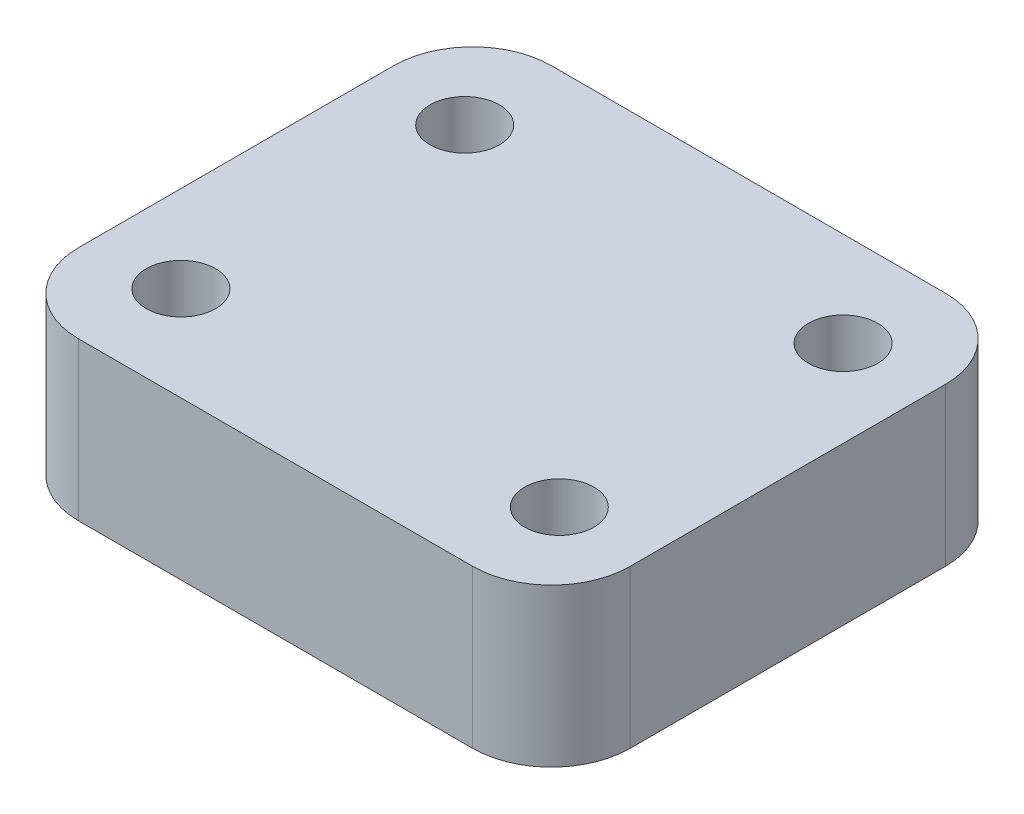
ISO-10303-21;
HEADER;
FILE_DESCRIPTION(('STEP AP214'),'2;1');
FILE_NAME('part.step','',(''),(''),'','','');
FILE_SCHEMA(('AUTOMOTIVE_DESIGN { 1 0 10303 214 1 1 1 1 }'));
ENDSEC;
DATA;
#1=APPLICATION_CONTEXT('core data for automotive mechanical design processes');
#2=APPLICATION_PROTOCOL_DEFINITION('international standard','automotive_design',2000,#1);
#3=PRODUCT_CONTEXT('',#1,'mechanical');
#4=PRODUCT('Part','Part','',(#3));
#5=PRODUCT_RELATED_PRODUCT_CATEGORY('part','',(#4));
#6=PRODUCT_DEFINITION_FORMATION('','',#4);
#7=PRODUCT_DEFINITION_CONTEXT('part definition',#1,'design');
#8=PRODUCT_DEFINITION('design','',#6,#7);
#9=PRODUCT_DEFINITION_SHAPE('','',#8);
#10=(LENGTH_UNIT() NAMED_UNIT(*) SI_UNIT(.MILLI.,.METRE.));
#11=(NAMED_UNIT(*) PLANE_ANGLE_UNIT() SI_UNIT($,.RADIAN.));
#12=(NAMED_UNIT(*) SI_UNIT($,.STERADIAN.) SOLID_ANGLE_UNIT());
#13=UNCERTAINTY_MEASURE_WITH_UNIT(LENGTH_MEASURE(1.E-05),#10,'distance_accuracy_value','');
#14=(GEOMETRIC_REPRESENTATION_CONTEXT(3) GLOBAL_UNCERTAINTY_ASSIGNED_CONTEXT((#13)) GLOBAL_UNIT_ASSIGNED_CONTEXT((#10,
#11,#12)) REPRESENTATION_CONTEXT('',''));
#15=CARTESIAN_POINT('',(0.,0.,0.));
#16=DIRECTION('',(0.,0.,1.));
#17=DIRECTION('',(1.,0.,0.));
#18=AXIS2_PLACEMENT_3D('',#15,#16,#17);
#19=CARTESIAN_POINT('',(17.5,10.,-15.));
#20=DIRECTION('',(-1.,0.,0.));
#21=DIRECTION('',(0.,0.,1.));
#22=AXIS2_PLACEMENT_3D('',#19,#20,#21);
#23=PLANE('',#22);
#24=DIRECTION('',(0.,0.,-1.));
#25=VECTOR('',#24,1.);
#26=CARTESIAN_POINT('',(17.5,0.,-15.));
#27=LINE('',#26,#25);
#28=CARTESIAN_POINT('',(17.5,0.,10.));
#29=VERTEX_POINT('',#28);
#30=CARTESIAN_POINT('',(17.5,0.,-10.));
#31=VERTEX_POINT('',#30);
#32=EDGE_CURVE('E140',#29,#31,#27,.T.);
#33=ORIENTED_EDGE('',*,*,#32,.T.);
#34=DIRECTION('',(0.,-1.,0.));
#35=VECTOR('',#34,1.);
#36=CARTESIAN_POINT('',(17.5,10.,-10.));
#37=LINE('',#36,#35);
#38=CARTESIAN_POINT('',(17.5,10.,-10.));
#39=VERTEX_POINT('',#38);
#40=EDGE_CURVE('E174',#31,#39,#37,.F.);
#41=ORIENTED_EDGE('',*,*,#40,.T.);
#42=DIRECTION('',(0.,0.,-1.));
#43=VECTOR('',#42,1.);
#44=CARTESIAN_POINT('',(17.5,10.,-15.));
#45=LINE('',#44,#43);
#46=CARTESIAN_POINT('',(17.5,10.,10.));
#47=VERTEX_POINT('',#46);
#48=EDGE_CURVE('E138',#47,#39,#45,.T.);
#49=ORIENTED_EDGE('',*,*,#48,.F.);
#50=DIRECTION('',(0.,-1.,0.));
#51=VECTOR('',#50,1.);
#52=CARTESIAN_POINT('',(17.5,10.,10.));
#53=LINE('',#52,#51);
#54=EDGE_CURVE('E170',#47,#29,#53,.T.);
#55=ORIENTED_EDGE('',*,*,#54,.T.);
#56=EDGE_LOOP('',(#33,#41,#49,#55));
#57=FACE_BOUND('',#56,.T.);
#58=ADVANCED_FACE('F39',(#57),#23,.F.);
#59=CARTESIAN_POINT('',(-17.5,10.,-15.));
#60=DIRECTION('',(0.,0.,1.));
#61=DIRECTION('',(1.,0.,0.));
#62=AXIS2_PLACEMENT_3D('',#59,#60,#61);
#63=PLANE('',#62);
#64=DIRECTION('',(-1.,0.,0.));
#65=VECTOR('',#64,1.);
#66=CARTESIAN_POINT('',(-17.5,0.,-15.));
#67=LINE('',#66,#65);
#68=CARTESIAN_POINT('',(12.5,0.,-15.));
#69=VERTEX_POINT('',#68);
#70=CARTESIAN_POINT('',(-12.5,0.,-15.));
#71=VERTEX_POINT('',#70);
#72=EDGE_CURVE('E134',#69,#71,#67,.T.);
#73=ORIENTED_EDGE('',*,*,#72,.T.);
#74=DIRECTION('',(0.,-1.,0.));
#75=VECTOR('',#74,1.);
#76=CARTESIAN_POINT('',(-12.5,10.,-15.));
#77=LINE('',#76,#75);
#78=CARTESIAN_POINT('',(-12.5,10.,-15.));
#79=VERTEX_POINT('',#78);
#80=EDGE_CURVE('E110',#71,#79,#77,.F.);
#81=ORIENTED_EDGE('',*,*,#80,.T.);
#82=DIRECTION('',(-1.,0.,0.));
#83=VECTOR('',#82,1.);
#84=CARTESIAN_POINT('',(-17.5,10.,-15.));
#85=LINE('',#84,#83);
#86=CARTESIAN_POINT('',(12.5,10.,-15.));
#87=VERTEX_POINT('',#86);
#88=EDGE_CURVE('E193',#87,#79,#85,.T.);
#89=ORIENTED_EDGE('',*,*,#88,.F.);
#90=DIRECTION('',(0.,-1.,0.));
#91=VECTOR('',#90,1.);
#92=CARTESIAN_POINT('',(12.5,10.,-15.));
#93=LINE('',#92,#91);
#94=EDGE_CURVE('E116',#87,#69,#93,.T.);
#95=ORIENTED_EDGE('',*,*,#94,.T.);
#96=EDGE_LOOP('',(#73,#81,#89,#95));
#97=FACE_BOUND('',#96,.T.);
#98=ADVANCED_FACE('F257',(#97),#63,.F.);
#99=CARTESIAN_POINT('',(-17.5,10.,-15.));
#100=DIRECTION('',(1.,0.,0.));
#101=DIRECTION('',(0.,0.,-1.));
#102=AXIS2_PLACEMENT_3D('',#99,#100,#101);
#103=PLANE('',#102);
#104=DIRECTION('',(0.,0.,1.));
#105=VECTOR('',#104,1.);
#106=CARTESIAN_POINT('',(-17.5,10.,-15.));
#107=LINE('',#106,#105);
#108=CARTESIAN_POINT('',(-17.5,10.,-10.));
#109=VERTEX_POINT('',#108);
#110=CARTESIAN_POINT('',(-17.5,10.,10.));
#111=VERTEX_POINT('',#110);
#112=EDGE_CURVE('E125',#109,#111,#107,.T.);
#113=ORIENTED_EDGE('',*,*,#112,.F.);
#114=DIRECTION('',(0.,-1.,0.));
#115=VECTOR('',#114,1.);
#116=CARTESIAN_POINT('',(-17.5,10.,-10.));
#117=LINE('',#116,#115);
#118=CARTESIAN_POINT('',(-17.5,0.,-10.));
#119=VERTEX_POINT('',#118);
#120=EDGE_CURVE('E109',#109,#119,#117,.T.);
#121=ORIENTED_EDGE('',*,*,#120,.T.);
#122=DIRECTION('',(0.,0.,1.));
#123=VECTOR('',#122,1.);
#124=CARTESIAN_POINT('',(-17.5,0.,-15.));
#125=LINE('',#124,#123);
#126=CARTESIAN_POINT('',(-17.5,0.,10.));
#127=VERTEX_POINT('',#126);
#128=EDGE_CURVE('E123',#119,#127,#125,.T.);
#129=ORIENTED_EDGE('',*,*,#128,.T.);
#130=DIRECTION('',(0.,-1.,0.));
#131=VECTOR('',#130,1.);
#132=CARTESIAN_POINT('',(-17.5,10.,10.));
#133=LINE('',#132,#131);
#134=EDGE_CURVE('E128',#127,#111,#133,.F.);
#135=ORIENTED_EDGE('',*,*,#134,.T.);
#136=EDGE_LOOP('',(#113,#121,#129,#135));
#137=FACE_BOUND('',#136,.T.);
#138=ADVANCED_FACE('F122',(#137),#103,.F.);
#139=CARTESIAN_POINT('',(-17.5,10.,15.));
#140=DIRECTION('',(0.,0.,-1.));
#141=DIRECTION('',(-1.,0.,0.));
#142=AXIS2_PLACEMENT_3D('',#139,#140,#141);
#143=PLANE('',#142);
#144=DIRECTION('',(1.,0.,0.));
#145=VECTOR('',#144,1.);
#146=CARTESIAN_POINT('',(-17.5,0.,15.));
#147=LINE('',#146,#145);
#148=CARTESIAN_POINT('',(-12.5,0.,15.));
#149=VERTEX_POINT('',#148);
#150=CARTESIAN_POINT('',(12.5,0.,15.));
#151=VERTEX_POINT('',#150);
#152=EDGE_CURVE('E133',#149,#151,#147,.T.);
#153=ORIENTED_EDGE('',*,*,#152,.T.);
#154=DIRECTION('',(0.,-1.,0.));
#155=VECTOR('',#154,1.);
#156=CARTESIAN_POINT('',(12.5,10.,15.));
#157=LINE('',#156,#155);
#158=CARTESIAN_POINT('',(12.5,10.,15.));
#159=VERTEX_POINT('',#158);
#160=EDGE_CURVE('E11',#151,#159,#157,.F.);
#161=ORIENTED_EDGE('',*,*,#160,.T.);
#162=DIRECTION('',(1.,0.,0.));
#163=VECTOR('',#162,1.);
#164=CARTESIAN_POINT('',(-17.5,10.,15.));
#165=LINE('',#164,#163);
#166=CARTESIAN_POINT('',(-12.5,10.,15.));
#167=VERTEX_POINT('',#166);
#168=EDGE_CURVE('E145',#167,#159,#165,.T.);
#169=ORIENTED_EDGE('',*,*,#168,.F.);
#170=DIRECTION('',(0.,-1.,0.));
#171=VECTOR('',#170,1.);
#172=CARTESIAN_POINT('',(-12.5,10.,15.));
#173=LINE('',#172,#171);
#174=EDGE_CURVE('E48',#167,#149,#173,.T.);
#175=ORIENTED_EDGE('',*,*,#174,.T.);
#176=EDGE_LOOP('',(#153,#161,#169,#175));
#177=FACE_BOUND('',#176,.T.);
#178=ADVANCED_FACE('F179',(#177),#143,.F.);
#179=CARTESIAN_POINT('',(0.,10.,0.));
#180=DIRECTION('',(0.,1.,0.));
#181=DIRECTION('',(0.,0.,1.));
#182=AXIS2_PLACEMENT_3D('',#179,#180,#181);
#183=PLANE('',#182);
#184=CARTESIAN_POINT('',(-12.,10.,9.));
#185=DIRECTION('',(0.,1.,0.));
#186=DIRECTION('',(0.,0.,1.));
#187=AXIS2_PLACEMENT_3D('',#184,#185,#186);
#188=CIRCLE('',#187,2.2);
#189=CARTESIAN_POINT('',(-12.,10.,11.2));
#190=VERTEX_POINT('',#189);
#191=EDGE_CURVE('E215',#190,#190,#188,.T.);
#192=ORIENTED_EDGE('',*,*,#191,.F.);
#193=EDGE_LOOP('',(#192));
#194=FACE_BOUND('',#193,.T.);
#195=CARTESIAN_POINT('',(12.,10.,9.));
#196=DIRECTION('',(0.,1.,0.));
#197=DIRECTION('',(0.,0.,1.));
#198=AXIS2_PLACEMENT_3D('',#195,#196,#197);
#199=CIRCLE('',#198,2.2);
#200=CARTESIAN_POINT('',(12.,10.,11.2));
#201=VERTEX_POINT('',#200);
#202=EDGE_CURVE('E223',#201,#201,#199,.T.);
#203=ORIENTED_EDGE('',*,*,#202,.F.);
#204=EDGE_LOOP('',(#203));
#205=FACE_BOUND('',#204,.T.);
#206=CARTESIAN_POINT('',(12.,10.,-9.));
#207=DIRECTION('',(0.,1.,0.));
#208=DIRECTION('',(0.,0.,1.));
#209=AXIS2_PLACEMENT_3D('',#206,#207,#208);
#210=CIRCLE('',#209,2.2);
#211=CARTESIAN_POINT('',(12.,10.,-6.8));
#212=VERTEX_POINT('',#211);
#213=EDGE_CURVE('E231',#212,#212,#210,.T.);
#214=ORIENTED_EDGE('',*,*,#213,.F.);
#215=EDGE_LOOP('',(#214));
#216=FACE_BOUND('',#215,.T.);
#217=CARTESIAN_POINT('',(-12.,10.,-9.));
#218=DIRECTION('',(0.,1.,0.));
#219=DIRECTION('',(0.,0.,1.));
#220=AXIS2_PLACEMENT_3D('',#217,#218,#219);
#221=CIRCLE('',#220,2.2);
#222=CARTESIAN_POINT('',(-12.,10.,-6.8));
#223=VERTEX_POINT('',#222);
#224=EDGE_CURVE('E199',#223,#223,#221,.T.);
#225=ORIENTED_EDGE('',*,*,#224,.F.);
#226=EDGE_LOOP('',(#225));
#227=FACE_BOUND('',#226,.T.);
#228=ORIENTED_EDGE('',*,*,#88,.T.);
#229=CARTESIAN_POINT('',(-12.5,10.,-10.));
#230=DIRECTION('',(0.,1.,0.));
#231=DIRECTION('',(0.,0.,1.));
#232=AXIS2_PLACEMENT_3D('',#229,#230,#231);
#233=CIRCLE('',#232,5.);
#234=EDGE_CURVE('E167',#79,#109,#233,.T.);
#235=ORIENTED_EDGE('',*,*,#234,.T.);
#236=ORIENTED_EDGE('',*,*,#112,.T.);
#237=CARTESIAN_POINT('',(-12.5,10.,10.));
#238=DIRECTION('',(0.,1.,0.));
#239=DIRECTION('',(0.,0.,1.));
#240=AXIS2_PLACEMENT_3D('',#237,#238,#239);
#241=CIRCLE('',#240,5.);
#242=EDGE_CURVE('E60',#111,#167,#241,.T.);
#243=ORIENTED_EDGE('',*,*,#242,.T.);
#244=ORIENTED_EDGE('',*,*,#168,.T.);
#245=CARTESIAN_POINT('',(12.5,10.,10.));
#246=DIRECTION('',(0.,1.,0.));
#247=DIRECTION('',(0.,0.,1.));
#248=AXIS2_PLACEMENT_3D('',#245,#246,#247);
#249=CIRCLE('',#248,5.);
#250=EDGE_CURVE('E161',#159,#47,#249,.T.);
#251=ORIENTED_EDGE('',*,*,#250,.T.);
#252=ORIENTED_EDGE('',*,*,#48,.T.);
#253=CARTESIAN_POINT('',(12.5,10.,-10.));
#254=DIRECTION('',(0.,1.,0.));
#255=DIRECTION('',(0.,0.,1.));
#256=AXIS2_PLACEMENT_3D('',#253,#254,#255);
#257=CIRCLE('',#256,5.);
#258=EDGE_CURVE('E164',#39,#87,#257,.T.);
#259=ORIENTED_EDGE('',*,*,#258,.T.);
#260=EDGE_LOOP('',(#228,#235,#236,#243,#244,#251,#252,#259));
#261=FACE_BOUND('',#260,.T.);
#262=ADVANCED_FACE('F248',(#194,#205,#216,#227,#261),#183,.T.);
#263=CARTESIAN_POINT('',(0.,0.,0.));
#264=DIRECTION('',(0.,1.,0.));
#265=DIRECTION('',(0.,0.,1.));
#266=AXIS2_PLACEMENT_3D('',#263,#264,#265);
#267=PLANE('',#266);
#268=CARTESIAN_POINT('',(-12.,0.,9.));
#269=DIRECTION('',(0.,1.,0.));
#270=DIRECTION('',(0.,0.,1.));
#271=AXIS2_PLACEMENT_3D('',#268,#269,#270);
#272=CIRCLE('',#271,2.2);
#273=CARTESIAN_POINT('',(-12.,0.,11.2));
#274=VERTEX_POINT('',#273);
#275=EDGE_CURVE('E219',#274,#274,#272,.T.);
#276=ORIENTED_EDGE('',*,*,#275,.T.);
#277=EDGE_LOOP('',(#276));
#278=FACE_BOUND('',#277,.T.);
#279=CARTESIAN_POINT('',(12.,0.,9.));
#280=DIRECTION('',(0.,1.,0.));
#281=DIRECTION('',(0.,0.,1.));
#282=AXIS2_PLACEMENT_3D('',#279,#280,#281);
#283=CIRCLE('',#282,2.2);
#284=CARTESIAN_POINT('',(12.,0.,11.2));
#285=VERTEX_POINT('',#284);
#286=EDGE_CURVE('E227',#285,#285,#283,.T.);
#287=ORIENTED_EDGE('',*,*,#286,.T.);
#288=EDGE_LOOP('',(#287));
#289=FACE_BOUND('',#288,.T.);
#290=CARTESIAN_POINT('',(12.,0.,-9.));
#291=DIRECTION('',(0.,1.,0.));
#292=DIRECTION('',(0.,0.,1.));
#293=AXIS2_PLACEMENT_3D('',#290,#291,#292);
#294=CIRCLE('',#293,2.2);
#295=CARTESIAN_POINT('',(12.,0.,-6.8));
#296=VERTEX_POINT('',#295);
#297=EDGE_CURVE('E213',#296,#296,#294,.T.);
#298=ORIENTED_EDGE('',*,*,#297,.T.);
#299=EDGE_LOOP('',(#298));
#300=FACE_BOUND('',#299,.T.);
#301=CARTESIAN_POINT('',(-12.,0.,-9.));
#302=DIRECTION('',(0.,1.,0.));
#303=DIRECTION('',(0.,0.,1.));
#304=AXIS2_PLACEMENT_3D('',#301,#302,#303);
#305=CIRCLE('',#304,2.2);
#306=CARTESIAN_POINT('',(-12.,0.,-6.8));
#307=VERTEX_POINT('',#306);
#308=EDGE_CURVE('E206',#307,#307,#305,.T.);
#309=ORIENTED_EDGE('',*,*,#308,.T.);
#310=EDGE_LOOP('',(#309));
#311=FACE_BOUND('',#310,.T.);
#312=ORIENTED_EDGE('',*,*,#128,.F.);
#313=CARTESIAN_POINT('',(-12.5,0.,-10.));
#314=DIRECTION('',(0.,1.,0.));
#315=DIRECTION('',(0.,0.,1.));
#316=AXIS2_PLACEMENT_3D('',#313,#314,#315);
#317=CIRCLE('',#316,5.);
#318=EDGE_CURVE('E105',#119,#71,#317,.F.);
#319=ORIENTED_EDGE('',*,*,#318,.T.);
#320=ORIENTED_EDGE('',*,*,#72,.F.);
#321=CARTESIAN_POINT('',(12.5,0.,-10.));
#322=DIRECTION('',(0.,1.,0.));
#323=DIRECTION('',(0.,0.,1.));
#324=AXIS2_PLACEMENT_3D('',#321,#322,#323);
#325=CIRCLE('',#324,5.);
#326=EDGE_CURVE('E117',#69,#31,#325,.F.);
#327=ORIENTED_EDGE('',*,*,#326,.T.);
#328=ORIENTED_EDGE('',*,*,#32,.F.);
#329=CARTESIAN_POINT('',(12.5,0.,10.));
#330=DIRECTION('',(0.,1.,0.));
#331=DIRECTION('',(0.,0.,1.));
#332=AXIS2_PLACEMENT_3D('',#329,#330,#331);
#333=CIRCLE('',#332,5.);
#334=EDGE_CURVE('E149',#29,#151,#333,.F.);
#335=ORIENTED_EDGE('',*,*,#334,.T.);
#336=ORIENTED_EDGE('',*,*,#152,.F.);
#337=CARTESIAN_POINT('',(-12.5,0.,10.));
#338=DIRECTION('',(0.,1.,0.));
#339=DIRECTION('',(0.,0.,1.));
#340=AXIS2_PLACEMENT_3D('',#337,#338,#339);
#341=CIRCLE('',#340,5.);
#342=EDGE_CURVE('E127',#149,#127,#341,.F.);
#343=ORIENTED_EDGE('',*,*,#342,.T.);
#344=EDGE_LOOP('',(#312,#319,#320,#327,#328,#335,#336,#343));
#345=FACE_BOUND('',#344,.T.);
#346=ADVANCED_FACE('F130',(#278,#289,#300,#311,#345),#267,.F.);
#347=CARTESIAN_POINT('',(-12.,0.,-9.));
#348=DIRECTION('',(0.,1.,0.));
#349=DIRECTION('',(0.,0.,1.));
#350=AXIS2_PLACEMENT_3D('',#347,#348,#349);
#351=CYLINDRICAL_SURFACE('',#350,2.2);
#352=ORIENTED_EDGE('',*,*,#308,.F.);
#353=EDGE_LOOP('',(#352));
#354=FACE_BOUND('',#353,.T.);
#355=ORIENTED_EDGE('',*,*,#224,.T.);
#356=EDGE_LOOP('',(#355));
#357=FACE_BOUND('',#356,.T.);
#358=ADVANCED_FACE('F244',(#354,#357),#351,.F.);
#359=CARTESIAN_POINT('',(12.,0.,-9.));
#360=DIRECTION('',(0.,1.,0.));
#361=DIRECTION('',(0.,0.,1.));
#362=AXIS2_PLACEMENT_3D('',#359,#360,#361);
#363=CYLINDRICAL_SURFACE('',#362,2.2);
#364=ORIENTED_EDGE('',*,*,#297,.F.);
#365=EDGE_LOOP('',(#364));
#366=FACE_BOUND('',#365,.T.);
#367=ORIENTED_EDGE('',*,*,#213,.T.);
#368=EDGE_LOOP('',(#367));
#369=FACE_BOUND('',#368,.T.);
#370=ADVANCED_FACE('F240',(#366,#369),#363,.F.);
#371=CARTESIAN_POINT('',(12.,0.,9.));
#372=DIRECTION('',(0.,1.,0.));
#373=DIRECTION('',(0.,0.,1.));
#374=AXIS2_PLACEMENT_3D('',#371,#372,#373);
#375=CYLINDRICAL_SURFACE('',#374,2.2);
#376=ORIENTED_EDGE('',*,*,#286,.F.);
#377=EDGE_LOOP('',(#376));
#378=FACE_BOUND('',#377,.T.);
#379=ORIENTED_EDGE('',*,*,#202,.T.);
#380=EDGE_LOOP('',(#379));
#381=FACE_BOUND('',#380,.T.);
#382=ADVANCED_FACE('F243',(#378,#381),#375,.F.);
#383=CARTESIAN_POINT('',(-12.,0.,9.));
#384=DIRECTION('',(0.,1.,0.));
#385=DIRECTION('',(0.,0.,1.));
#386=AXIS2_PLACEMENT_3D('',#383,#384,#385);
#387=CYLINDRICAL_SURFACE('',#386,2.2);
#388=ORIENTED_EDGE('',*,*,#275,.F.);
#389=EDGE_LOOP('',(#388));
#390=FACE_BOUND('',#389,.T.);
#391=ORIENTED_EDGE('',*,*,#191,.T.);
#392=EDGE_LOOP('',(#391));
#393=FACE_BOUND('',#392,.T.);
#394=ADVANCED_FACE('F266',(#390,#393),#387,.F.);
#395=CARTESIAN_POINT('',(-12.5,10.,-10.));
#396=DIRECTION('',(0.,-1.,0.));
#397=DIRECTION('',(0.,0.,-1.));
#398=AXIS2_PLACEMENT_3D('',#395,#396,#397);
#399=CYLINDRICAL_SURFACE('',#398,5.);
#400=ORIENTED_EDGE('',*,*,#234,.F.);
#401=ORIENTED_EDGE('',*,*,#80,.F.);
#402=ORIENTED_EDGE('',*,*,#318,.F.);
#403=ORIENTED_EDGE('',*,*,#120,.F.);
#404=EDGE_LOOP('',(#400,#401,#402,#403));
#405=FACE_BOUND('',#404,.T.);
#406=ADVANCED_FACE('F108',(#405),#399,.T.);
#407=CARTESIAN_POINT('',(12.5,10.,-10.));
#408=DIRECTION('',(0.,-1.,0.));
#409=DIRECTION('',(0.,0.,-1.));
#410=AXIS2_PLACEMENT_3D('',#407,#408,#409);
#411=CYLINDRICAL_SURFACE('',#410,5.);
#412=ORIENTED_EDGE('',*,*,#258,.F.);
#413=ORIENTED_EDGE('',*,*,#40,.F.);
#414=ORIENTED_EDGE('',*,*,#326,.F.);
#415=ORIENTED_EDGE('',*,*,#94,.F.);
#416=EDGE_LOOP('',(#412,#413,#414,#415));
#417=FACE_BOUND('',#416,.T.);
#418=ADVANCED_FACE('F259',(#417),#411,.T.);
#419=CARTESIAN_POINT('',(12.5,10.,10.));
#420=DIRECTION('',(0.,-1.,0.));
#421=DIRECTION('',(0.,0.,-1.));
#422=AXIS2_PLACEMENT_3D('',#419,#420,#421);
#423=CYLINDRICAL_SURFACE('',#422,5.);
#424=ORIENTED_EDGE('',*,*,#250,.F.);
#425=ORIENTED_EDGE('',*,*,#160,.F.);
#426=ORIENTED_EDGE('',*,*,#334,.F.);
#427=ORIENTED_EDGE('',*,*,#54,.F.);
#428=EDGE_LOOP('',(#424,#425,#426,#427));
#429=FACE_BOUND('',#428,.T.);
#430=ADVANCED_FACE('F186',(#429),#423,.T.);
#431=CARTESIAN_POINT('',(-12.5,10.,10.));
#432=DIRECTION('',(0.,-1.,0.));
#433=DIRECTION('',(0.,0.,-1.));
#434=AXIS2_PLACEMENT_3D('',#431,#432,#433);
#435=CYLINDRICAL_SURFACE('',#434,5.);
#436=ORIENTED_EDGE('',*,*,#242,.F.);
#437=ORIENTED_EDGE('',*,*,#134,.F.);
#438=ORIENTED_EDGE('',*,*,#342,.F.);
#439=ORIENTED_EDGE('',*,*,#174,.F.);
#440=EDGE_LOOP('',(#436,#437,#438,#439));
#441=FACE_BOUND('',#440,.T.);
#442=ADVANCED_FACE('F41',(#441),#435,.T.);
#443=CLOSED_SHELL('',(#58,#98,#138,#178,#262,#346,#358,#370,#382,#394,#406,#418,#430,#442));
#444=MANIFOLD_SOLID_BREP('B2',#443);
#445=ADVANCED_BREP_SHAPE_REPRESENTATION('',(#18,#444),#14);
#446=SHAPE_DEFINITION_REPRESENTATION(#9,#445);
ENDSEC;
END-ISO-10303-21;
